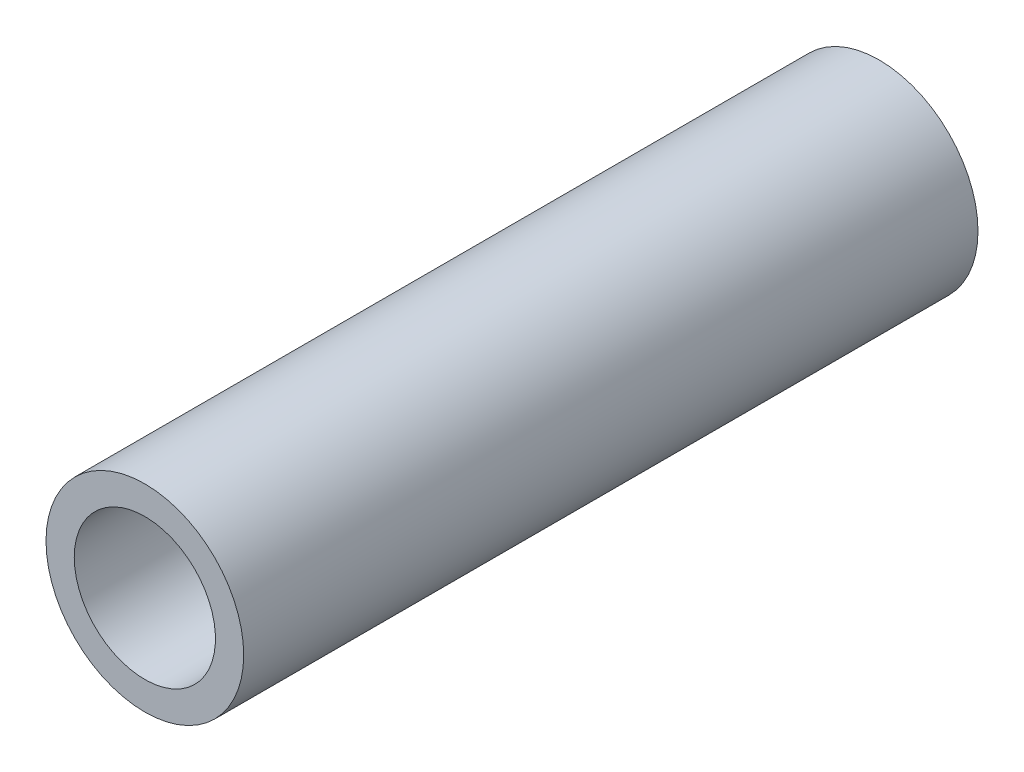
ISO-10303-21;
HEADER;
FILE_DESCRIPTION(('STEP AP214'),'2;1');
FILE_NAME('part.step','',(''),(''),'','','');
FILE_SCHEMA(('AUTOMOTIVE_DESIGN { 1 0 10303 214 1 1 1 1 }'));
ENDSEC;
DATA;
#1=APPLICATION_CONTEXT('core data for automotive mechanical design processes');
#2=APPLICATION_PROTOCOL_DEFINITION('international standard','automotive_design',2000,#1);
#3=PRODUCT_CONTEXT('',#1,'mechanical');
#4=PRODUCT('Part','Part','',(#3));
#5=PRODUCT_RELATED_PRODUCT_CATEGORY('part','',(#4));
#6=PRODUCT_DEFINITION_FORMATION('','',#4);
#7=PRODUCT_DEFINITION_CONTEXT('part definition',#1,'design');
#8=PRODUCT_DEFINITION('design','',#6,#7);
#9=PRODUCT_DEFINITION_SHAPE('','',#8);
#10=(LENGTH_UNIT() NAMED_UNIT(*) SI_UNIT(.MILLI.,.METRE.));
#11=(NAMED_UNIT(*) PLANE_ANGLE_UNIT() SI_UNIT($,.RADIAN.));
#12=(NAMED_UNIT(*) SI_UNIT($,.STERADIAN.) SOLID_ANGLE_UNIT());
#13=UNCERTAINTY_MEASURE_WITH_UNIT(LENGTH_MEASURE(1.E-05),#10,'distance_accuracy_value','');
#14=(GEOMETRIC_REPRESENTATION_CONTEXT(3) GLOBAL_UNCERTAINTY_ASSIGNED_CONTEXT((#13)) GLOBAL_UNIT_ASSIGNED_CONTEXT((#10,
#11,#12)) REPRESENTATION_CONTEXT('',''));
#15=CARTESIAN_POINT('',(0.,0.,0.));
#16=DIRECTION('',(0.,0.,1.));
#17=DIRECTION('',(1.,0.,0.));
#18=AXIS2_PLACEMENT_3D('',#15,#16,#17);
#19=CARTESIAN_POINT('',(0.,0.,26.));
#20=DIRECTION('',(0.,0.,1.));
#21=DIRECTION('',(1.,0.,0.));
#22=AXIS2_PLACEMENT_3D('',#19,#20,#21);
#23=PLANE('',#22);
#24=CARTESIAN_POINT('',(0.,0.,26.));
#25=DIRECTION('',(0.,0.,1.));
#26=DIRECTION('',(1.,0.,0.));
#27=AXIS2_PLACEMENT_3D('',#24,#25,#26);
#28=CIRCLE('',#27,7.);
#29=CARTESIAN_POINT('',(-7.,0.,26.));
#30=VERTEX_POINT('',#29);
#31=EDGE_CURVE('E10',#30,#30,#28,.T.);
#32=ORIENTED_EDGE('',*,*,#31,.T.);
#33=EDGE_LOOP('',(#32));
#34=FACE_BOUND('',#33,.T.);
#35=CARTESIAN_POINT('',(0.,0.,26.));
#36=DIRECTION('',(0.,0.,1.));
#37=DIRECTION('',(1.,0.,0.));
#38=AXIS2_PLACEMENT_3D('',#35,#36,#37);
#39=CIRCLE('',#38,5.);
#40=CARTESIAN_POINT('',(-5.,0.,26.));
#41=VERTEX_POINT('',#40);
#42=EDGE_CURVE('E44',#41,#41,#39,.T.);
#43=ORIENTED_EDGE('',*,*,#42,.F.);
#44=EDGE_LOOP('',(#43));
#45=FACE_BOUND('',#44,.T.);
#46=ADVANCED_FACE('F33',(#34,#45),#23,.T.);
#47=CARTESIAN_POINT('',(0.,0.,-26.));
#48=DIRECTION('',(0.,0.,1.));
#49=DIRECTION('',(1.,0.,0.));
#50=AXIS2_PLACEMENT_3D('',#47,#48,#49);
#51=PLANE('',#50);
#52=CARTESIAN_POINT('',(0.,0.,-26.));
#53=DIRECTION('',(0.,0.,1.));
#54=DIRECTION('',(1.,0.,0.));
#55=AXIS2_PLACEMENT_3D('',#52,#53,#54);
#56=CIRCLE('',#55,7.);
#57=CARTESIAN_POINT('',(-7.,0.,-26.));
#58=VERTEX_POINT('',#57);
#59=EDGE_CURVE('E37',#58,#58,#56,.T.);
#60=ORIENTED_EDGE('',*,*,#59,.F.);
#61=EDGE_LOOP('',(#60));
#62=FACE_BOUND('',#61,.T.);
#63=CARTESIAN_POINT('',(0.,0.,-26.));
#64=DIRECTION('',(0.,0.,1.));
#65=DIRECTION('',(1.,0.,0.));
#66=AXIS2_PLACEMENT_3D('',#63,#64,#65);
#67=CIRCLE('',#66,5.);
#68=CARTESIAN_POINT('',(-5.,0.,-26.));
#69=VERTEX_POINT('',#68);
#70=EDGE_CURVE('E46',#69,#69,#67,.T.);
#71=ORIENTED_EDGE('',*,*,#70,.T.);
#72=EDGE_LOOP('',(#71));
#73=FACE_BOUND('',#72,.T.);
#74=ADVANCED_FACE('F56',(#62,#73),#51,.F.);
#75=CARTESIAN_POINT('',(0.,0.,26.));
#76=DIRECTION('',(0.,0.,-1.));
#77=DIRECTION('',(-1.,0.,0.));
#78=AXIS2_PLACEMENT_3D('',#75,#76,#77);
#79=CYLINDRICAL_SURFACE('',#78,7.);
#80=CARTESIAN_POINT('',(-7.,0.,26.));
#81=CARTESIAN_POINT('',(-7.,0.,25.4583333333333));
#82=CARTESIAN_POINT('',(-7.,0.,24.9166666666667));
#83=CARTESIAN_POINT('',(-7.,0.,23.8333333333333));
#84=CARTESIAN_POINT('',(-7.,0.,23.2916666666667));
#85=CARTESIAN_POINT('',(-7.,0.,22.2083333333333));
#86=CARTESIAN_POINT('',(-7.,0.,21.6666666666667));
#87=CARTESIAN_POINT('',(-7.,0.,20.5833333333333));
#88=CARTESIAN_POINT('',(-7.,0.,20.0416666666667));
#89=CARTESIAN_POINT('',(-7.,0.,18.9583333333333));
#90=CARTESIAN_POINT('',(-7.,0.,18.4166666666667));
#91=CARTESIAN_POINT('',(-7.,0.,17.3333333333333));
#92=CARTESIAN_POINT('',(-7.,0.,16.7916666666667));
#93=CARTESIAN_POINT('',(-7.,0.,15.7083333333333));
#94=CARTESIAN_POINT('',(-7.,0.,15.1666666666667));
#95=CARTESIAN_POINT('',(-7.,0.,14.0833333333333));
#96=CARTESIAN_POINT('',(-7.,0.,13.5416666666667));
#97=CARTESIAN_POINT('',(-7.,0.,12.4583333333333));
#98=CARTESIAN_POINT('',(-7.,0.,11.9166666666667));
#99=CARTESIAN_POINT('',(-7.,0.,10.8333333333333));
#100=CARTESIAN_POINT('',(-7.,0.,10.2916666666667));
#101=CARTESIAN_POINT('',(-7.,0.,9.20833333333333));
#102=CARTESIAN_POINT('',(-7.,0.,8.66666666666666));
#103=CARTESIAN_POINT('',(-7.,0.,7.58333333333333));
#104=CARTESIAN_POINT('',(-7.,0.,7.04166666666666));
#105=CARTESIAN_POINT('',(-7.,0.,5.95833333333333));
#106=CARTESIAN_POINT('',(-7.,0.,5.41666666666666));
#107=CARTESIAN_POINT('',(-7.,0.,4.33333333333333));
#108=CARTESIAN_POINT('',(-7.,0.,3.79166666666666));
#109=CARTESIAN_POINT('',(-7.,0.,2.70833333333333));
#110=CARTESIAN_POINT('',(-7.,0.,2.16666666666666));
#111=CARTESIAN_POINT('',(-7.,0.,1.08333333333333));
#112=CARTESIAN_POINT('',(-7.,0.,0.541666666666664));
#113=CARTESIAN_POINT('',(-7.,0.,-0.54166666666667));
#114=CARTESIAN_POINT('',(-7.,0.,-1.08333333333334));
#115=CARTESIAN_POINT('',(-7.,0.,-2.16666666666667));
#116=CARTESIAN_POINT('',(-7.,0.,-2.70833333333334));
#117=CARTESIAN_POINT('',(-7.,0.,-3.79166666666667));
#118=CARTESIAN_POINT('',(-7.,0.,-4.33333333333334));
#119=CARTESIAN_POINT('',(-7.,0.,-5.41666666666667));
#120=CARTESIAN_POINT('',(-7.,0.,-5.95833333333333));
#121=CARTESIAN_POINT('',(-7.,0.,-7.04166666666666));
#122=CARTESIAN_POINT('',(-7.,0.,-7.58333333333333));
#123=CARTESIAN_POINT('',(-7.,0.,-8.66666666666666));
#124=CARTESIAN_POINT('',(-7.,0.,-9.20833333333333));
#125=CARTESIAN_POINT('',(-7.,0.,-10.2916666666667));
#126=CARTESIAN_POINT('',(-7.,0.,-10.8333333333333));
#127=CARTESIAN_POINT('',(-7.,0.,-11.9166666666667));
#128=CARTESIAN_POINT('',(-7.,0.,-12.4583333333333));
#129=CARTESIAN_POINT('',(-7.,0.,-13.5416666666667));
#130=CARTESIAN_POINT('',(-7.,0.,-14.0833333333333));
#131=CARTESIAN_POINT('',(-7.,0.,-15.1666666666667));
#132=CARTESIAN_POINT('',(-7.,0.,-15.7083333333333));
#133=CARTESIAN_POINT('',(-7.,0.,-16.7916666666667));
#134=CARTESIAN_POINT('',(-7.,0.,-17.3333333333333));
#135=CARTESIAN_POINT('',(-7.,0.,-18.4166666666667));
#136=CARTESIAN_POINT('',(-7.,0.,-18.9583333333333));
#137=CARTESIAN_POINT('',(-7.,0.,-20.0416666666667));
#138=CARTESIAN_POINT('',(-7.,0.,-20.5833333333333));
#139=CARTESIAN_POINT('',(-7.,0.,-21.6666666666667));
#140=CARTESIAN_POINT('',(-7.,0.,-22.2083333333333));
#141=CARTESIAN_POINT('',(-7.,0.,-23.2916666666667));
#142=CARTESIAN_POINT('',(-7.,0.,-23.8333333333333));
#143=CARTESIAN_POINT('',(-7.,0.,-24.9166666666667));
#144=CARTESIAN_POINT('',(-7.,0.,-25.4583333333333));
#145=CARTESIAN_POINT('',(-7.,0.,-26.));
#146=B_SPLINE_CURVE_WITH_KNOTS('',3,(#80,#81,#82,#83,#84,#85,#86,#87,#88,#89,#90,#91,#92,#93,
#94,#95,#96,#97,#98,#99,#100,#101,#102,#103,#104,#105,#106,#107,#108,#109,#110,#111,#112,#113,
#114,#115,#116,#117,#118,#119,#120,#121,#122,#123,#124,#125,#126,#127,#128,#129,#130,#131,#132,
#133,#134,#135,#136,#137,#138,#139,#140,#141,#142,#143,#144,#145),.UNSPECIFIED.,.F.,.F.,(4,2,2,
2,2,2,2,2,2,2,2,2,2,2,2,2,2,2,2,2,2,2,2,2,2,2,2,2,2,2,2,2,4),(0.,1.625,3.25,4.875,6.5,8.125,
9.75,11.375,13.,14.625,16.25,17.875,19.5,21.125,22.75,24.375,26.,27.625,29.25,30.875,32.5,
34.125,35.75,37.375,39.,40.625,42.25,43.875,45.5,47.125,48.75,50.375,52.),.UNSPECIFIED.);
#147=EDGE_CURVE('BSEAM35',#30,#58,#146,.T.);
#148=ORIENTED_EDGE('',*,*,#31,.F.);
#149=ORIENTED_EDGE('',*,*,#59,.T.);
#150=ORIENTED_EDGE('',*,*,#147,.T.);
#151=ORIENTED_EDGE('',*,*,#147,.F.);
#152=EDGE_LOOP('',(#148,#150,#149,#151));
#153=FACE_BOUND('',#152,.T.);
#154=ADVANCED_FACE('F35',(#153),#79,.T.);
#155=CARTESIAN_POINT('',(0.,0.,26.));
#156=DIRECTION('',(0.,0.,-1.));
#157=DIRECTION('',(-1.,0.,0.));
#158=AXIS2_PLACEMENT_3D('',#155,#156,#157);
#159=CYLINDRICAL_SURFACE('',#158,5.);
#160=CARTESIAN_POINT('',(-5.,0.,26.));
#161=CARTESIAN_POINT('',(-5.,0.,25.4583333333333));
#162=CARTESIAN_POINT('',(-5.,0.,24.9166666666667));
#163=CARTESIAN_POINT('',(-5.,0.,23.8333333333333));
#164=CARTESIAN_POINT('',(-5.,0.,23.2916666666667));
#165=CARTESIAN_POINT('',(-5.,0.,22.2083333333333));
#166=CARTESIAN_POINT('',(-5.,0.,21.6666666666667));
#167=CARTESIAN_POINT('',(-5.,0.,20.5833333333333));
#168=CARTESIAN_POINT('',(-5.,0.,20.0416666666667));
#169=CARTESIAN_POINT('',(-5.,0.,18.9583333333333));
#170=CARTESIAN_POINT('',(-5.,0.,18.4166666666667));
#171=CARTESIAN_POINT('',(-5.,0.,17.3333333333333));
#172=CARTESIAN_POINT('',(-5.,0.,16.7916666666667));
#173=CARTESIAN_POINT('',(-5.,0.,15.7083333333333));
#174=CARTESIAN_POINT('',(-5.,0.,15.1666666666667));
#175=CARTESIAN_POINT('',(-5.,0.,14.0833333333333));
#176=CARTESIAN_POINT('',(-5.,0.,13.5416666666667));
#177=CARTESIAN_POINT('',(-5.,0.,12.4583333333333));
#178=CARTESIAN_POINT('',(-5.,0.,11.9166666666667));
#179=CARTESIAN_POINT('',(-5.,0.,10.8333333333333));
#180=CARTESIAN_POINT('',(-5.,0.,10.2916666666667));
#181=CARTESIAN_POINT('',(-5.,0.,9.20833333333333));
#182=CARTESIAN_POINT('',(-5.,0.,8.66666666666666));
#183=CARTESIAN_POINT('',(-5.,0.,7.58333333333333));
#184=CARTESIAN_POINT('',(-5.,0.,7.04166666666666));
#185=CARTESIAN_POINT('',(-5.,0.,5.95833333333333));
#186=CARTESIAN_POINT('',(-5.,0.,5.41666666666666));
#187=CARTESIAN_POINT('',(-5.,0.,4.33333333333333));
#188=CARTESIAN_POINT('',(-5.,0.,3.79166666666666));
#189=CARTESIAN_POINT('',(-5.,0.,2.70833333333333));
#190=CARTESIAN_POINT('',(-5.,0.,2.16666666666666));
#191=CARTESIAN_POINT('',(-5.,0.,1.08333333333333));
#192=CARTESIAN_POINT('',(-5.,0.,0.541666666666664));
#193=CARTESIAN_POINT('',(-5.,0.,-0.54166666666667));
#194=CARTESIAN_POINT('',(-5.,0.,-1.08333333333334));
#195=CARTESIAN_POINT('',(-5.,0.,-2.16666666666667));
#196=CARTESIAN_POINT('',(-5.,0.,-2.70833333333334));
#197=CARTESIAN_POINT('',(-5.,0.,-3.79166666666667));
#198=CARTESIAN_POINT('',(-5.,0.,-4.33333333333334));
#199=CARTESIAN_POINT('',(-5.,0.,-5.41666666666667));
#200=CARTESIAN_POINT('',(-5.,0.,-5.95833333333333));
#201=CARTESIAN_POINT('',(-5.,0.,-7.04166666666666));
#202=CARTESIAN_POINT('',(-5.,0.,-7.58333333333333));
#203=CARTESIAN_POINT('',(-5.,0.,-8.66666666666666));
#204=CARTESIAN_POINT('',(-5.,0.,-9.20833333333333));
#205=CARTESIAN_POINT('',(-5.,0.,-10.2916666666667));
#206=CARTESIAN_POINT('',(-5.,0.,-10.8333333333333));
#207=CARTESIAN_POINT('',(-5.,0.,-11.9166666666667));
#208=CARTESIAN_POINT('',(-5.,0.,-12.4583333333333));
#209=CARTESIAN_POINT('',(-5.,0.,-13.5416666666667));
#210=CARTESIAN_POINT('',(-5.,0.,-14.0833333333333));
#211=CARTESIAN_POINT('',(-5.,0.,-15.1666666666667));
#212=CARTESIAN_POINT('',(-5.,0.,-15.7083333333333));
#213=CARTESIAN_POINT('',(-5.,0.,-16.7916666666667));
#214=CARTESIAN_POINT('',(-5.,0.,-17.3333333333333));
#215=CARTESIAN_POINT('',(-5.,0.,-18.4166666666667));
#216=CARTESIAN_POINT('',(-5.,0.,-18.9583333333333));
#217=CARTESIAN_POINT('',(-5.,0.,-20.0416666666667));
#218=CARTESIAN_POINT('',(-5.,0.,-20.5833333333333));
#219=CARTESIAN_POINT('',(-5.,0.,-21.6666666666667));
#220=CARTESIAN_POINT('',(-5.,0.,-22.2083333333333));
#221=CARTESIAN_POINT('',(-5.,0.,-23.2916666666667));
#222=CARTESIAN_POINT('',(-5.,0.,-23.8333333333333));
#223=CARTESIAN_POINT('',(-5.,0.,-24.9166666666667));
#224=CARTESIAN_POINT('',(-5.,0.,-25.4583333333333));
#225=CARTESIAN_POINT('',(-5.,0.,-26.));
#226=B_SPLINE_CURVE_WITH_KNOTS('',3,(#160,#161,#162,#163,#164,#165,#166,#167,#168,#169,#170,
#171,#172,#173,#174,#175,#176,#177,#178,#179,#180,#181,#182,#183,#184,#185,#186,#187,#188,#189,
#190,#191,#192,#193,#194,#195,#196,#197,#198,#199,#200,#201,#202,#203,#204,#205,#206,#207,#208,
#209,#210,#211,#212,#213,#214,#215,#216,#217,#218,#219,#220,#221,#222,#223,#224,#225),
.UNSPECIFIED.,.F.,.F.,(4,2,2,2,2,2,2,2,2,2,2,2,2,2,2,2,2,2,2,2,2,2,2,2,2,2,2,2,2,2,2,2,4),(0.,
1.625,3.25,4.875,6.5,8.125,9.75,11.375,13.,14.625,16.25,17.875,19.5,21.125,22.75,24.375,26.,
27.625,29.25,30.875,32.5,34.125,35.75,37.375,39.,40.625,42.25,43.875,45.5,47.125,48.75,50.375,
52.),.UNSPECIFIED.);
#227=EDGE_CURVE('BSEAM52',#41,#69,#226,.T.);
#228=ORIENTED_EDGE('',*,*,#42,.T.);
#229=ORIENTED_EDGE('',*,*,#70,.F.);
#230=ORIENTED_EDGE('',*,*,#227,.T.);
#231=ORIENTED_EDGE('',*,*,#227,.F.);
#232=EDGE_LOOP('',(#228,#230,#229,#231));
#233=FACE_BOUND('',#232,.T.);
#234=ADVANCED_FACE('F52',(#233),#159,.F.);
#235=CLOSED_SHELL('',(#46,#74,#154,#234));
#236=MANIFOLD_SOLID_BREP('B2',#235);
#237=ADVANCED_BREP_SHAPE_REPRESENTATION('',(#18,#236),#14);
#238=SHAPE_DEFINITION_REPRESENTATION(#9,#237);
ENDSEC;
END-ISO-10303-21;
